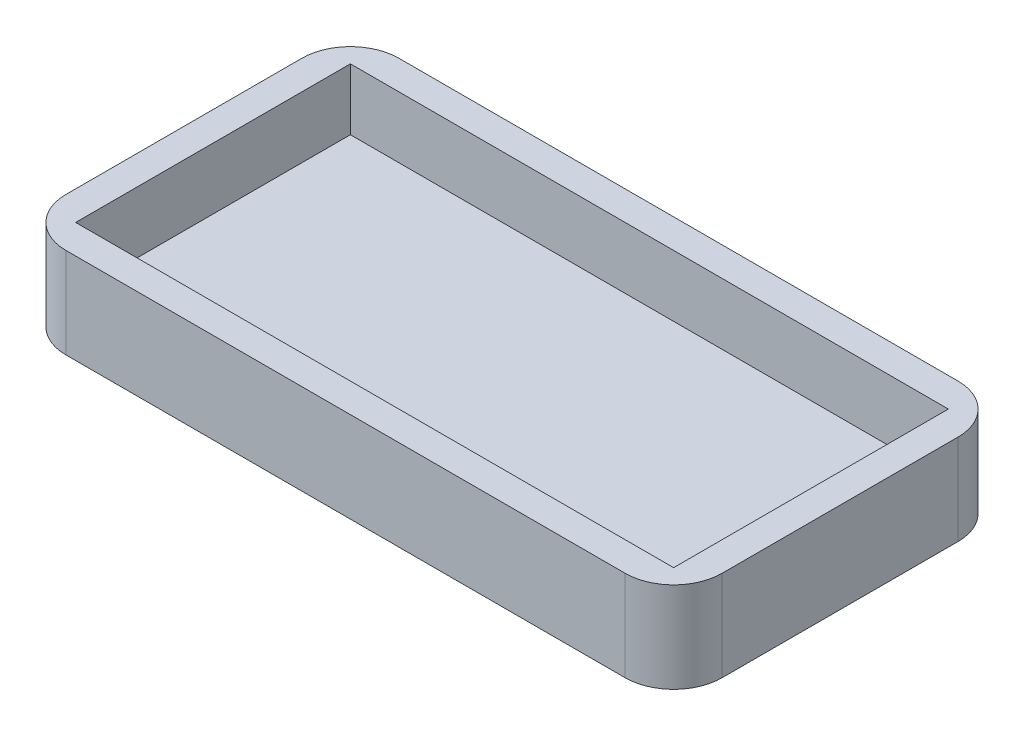
ISO-10303-21;
HEADER;
FILE_DESCRIPTION(('STEP AP214'),'2;1');
FILE_NAME('part.step','',(''),(''),'','','');
FILE_SCHEMA(('AUTOMOTIVE_DESIGN { 1 0 10303 214 1 1 1 1 }'));
ENDSEC;
DATA;
#1=APPLICATION_CONTEXT('core data for automotive mechanical design processes');
#2=APPLICATION_PROTOCOL_DEFINITION('international standard','automotive_design',2000,#1);
#3=PRODUCT_CONTEXT('',#1,'mechanical');
#4=PRODUCT('Part','Part','',(#3));
#5=PRODUCT_RELATED_PRODUCT_CATEGORY('part','',(#4));
#6=PRODUCT_DEFINITION_FORMATION('','',#4);
#7=PRODUCT_DEFINITION_CONTEXT('part definition',#1,'design');
#8=PRODUCT_DEFINITION('design','',#6,#7);
#9=PRODUCT_DEFINITION_SHAPE('','',#8);
#10=(LENGTH_UNIT() NAMED_UNIT(*) SI_UNIT(.MILLI.,.METRE.));
#11=(NAMED_UNIT(*) PLANE_ANGLE_UNIT() SI_UNIT($,.RADIAN.));
#12=(NAMED_UNIT(*) SI_UNIT($,.STERADIAN.) SOLID_ANGLE_UNIT());
#13=UNCERTAINTY_MEASURE_WITH_UNIT(LENGTH_MEASURE(1.E-05),#10,'distance_accuracy_value','');
#14=(GEOMETRIC_REPRESENTATION_CONTEXT(3) GLOBAL_UNCERTAINTY_ASSIGNED_CONTEXT((#13)) GLOBAL_UNIT_ASSIGNED_CONTEXT((#10,
#11,#12)) REPRESENTATION_CONTEXT('',''));
#15=CARTESIAN_POINT('',(0.,0.,0.));
#16=DIRECTION('',(0.,0.,1.));
#17=DIRECTION('',(1.,0.,0.));
#18=AXIS2_PLACEMENT_3D('',#15,#16,#17);
#19=CARTESIAN_POINT('',(0.,3.8,0.));
#20=DIRECTION('',(0.,-1.,0.));
#21=DIRECTION('',(0.,0.,-1.));
#22=AXIS2_PLACEMENT_3D('',#19,#20,#21);
#23=PLANE('',#22);
#24=DIRECTION('',(0.,0.,-1.));
#25=VECTOR('',#24,1.);
#26=CARTESIAN_POINT('',(20.3,3.8,0.));
#27=LINE('',#26,#25);
#28=CARTESIAN_POINT('',(20.3,3.8,7.3));
#29=VERTEX_POINT('',#28);
#30=CARTESIAN_POINT('',(20.3,3.8,-7.3));
#31=VERTEX_POINT('',#30);
#32=EDGE_CURVE('E175',#29,#31,#27,.T.);
#33=ORIENTED_EDGE('',*,*,#32,.T.);
#34=CARTESIAN_POINT('',(17.3,3.8,-7.3));
#35=DIRECTION('',(0.,-1.,0.));
#36=DIRECTION('',(0.,0.,-1.));
#37=AXIS2_PLACEMENT_3D('',#34,#35,#36);
#38=CIRCLE('',#37,3.);
#39=CARTESIAN_POINT('',(17.3,3.8,-10.3));
#40=VERTEX_POINT('',#39);
#41=EDGE_CURVE('E208',#31,#40,#38,.F.);
#42=ORIENTED_EDGE('',*,*,#41,.T.);
#43=DIRECTION('',(-1.,0.,0.));
#44=VECTOR('',#43,1.);
#45=CARTESIAN_POINT('',(0.,3.8,-10.3));
#46=LINE('',#45,#44);
#47=CARTESIAN_POINT('',(-17.3,3.8,-10.3));
#48=VERTEX_POINT('',#47);
#49=EDGE_CURVE('E178',#40,#48,#46,.T.);
#50=ORIENTED_EDGE('',*,*,#49,.T.);
#51=CARTESIAN_POINT('',(-17.3,3.8,-7.3));
#52=DIRECTION('',(0.,-1.,0.));
#53=DIRECTION('',(0.,0.,-1.));
#54=AXIS2_PLACEMENT_3D('',#51,#52,#53);
#55=CIRCLE('',#54,3.);
#56=CARTESIAN_POINT('',(-20.3,3.8,-7.3));
#57=VERTEX_POINT('',#56);
#58=EDGE_CURVE('E203',#48,#57,#55,.F.);
#59=ORIENTED_EDGE('',*,*,#58,.T.);
#60=DIRECTION('',(0.,0.,1.));
#61=VECTOR('',#60,1.);
#62=CARTESIAN_POINT('',(-20.3,3.8,0.));
#63=LINE('',#62,#61);
#64=CARTESIAN_POINT('',(-20.3,3.8,7.3));
#65=VERTEX_POINT('',#64);
#66=EDGE_CURVE('E181',#57,#65,#63,.T.);
#67=ORIENTED_EDGE('',*,*,#66,.T.);
#68=CARTESIAN_POINT('',(-17.3,3.8,7.3));
#69=DIRECTION('',(0.,-1.,0.));
#70=DIRECTION('',(0.,0.,-1.));
#71=AXIS2_PLACEMENT_3D('',#68,#69,#70);
#72=CIRCLE('',#71,3.);
#73=CARTESIAN_POINT('',(-17.3,3.8,10.3));
#74=VERTEX_POINT('',#73);
#75=EDGE_CURVE('E55',#65,#74,#72,.F.);
#76=ORIENTED_EDGE('',*,*,#75,.T.);
#77=DIRECTION('',(1.,0.,0.));
#78=VECTOR('',#77,1.);
#79=CARTESIAN_POINT('',(0.,3.8,10.3));
#80=LINE('',#79,#78);
#81=CARTESIAN_POINT('',(17.3,3.8,10.3));
#82=VERTEX_POINT('',#81);
#83=EDGE_CURVE('E183',#74,#82,#80,.T.);
#84=ORIENTED_EDGE('',*,*,#83,.T.);
#85=CARTESIAN_POINT('',(17.3,3.8,7.3));
#86=DIRECTION('',(0.,-1.,0.));
#87=DIRECTION('',(0.,0.,-1.));
#88=AXIS2_PLACEMENT_3D('',#85,#86,#87);
#89=CIRCLE('',#88,3.);
#90=EDGE_CURVE('E206',#82,#29,#89,.F.);
#91=ORIENTED_EDGE('',*,*,#90,.T.);
#92=EDGE_LOOP('',(#33,#42,#50,#59,#67,#76,#84,#91));
#93=FACE_BOUND('',#92,.T.);
#94=DIRECTION('',(0.,0.,-1.));
#95=VECTOR('',#94,1.);
#96=CARTESIAN_POINT('',(18.5,3.8,8.5));
#97=LINE('',#96,#95);
#98=CARTESIAN_POINT('',(18.5,3.8,8.5));
#99=VERTEX_POINT('',#98);
#100=CARTESIAN_POINT('',(18.5,3.8,-8.5));
#101=VERTEX_POINT('',#100);
#102=EDGE_CURVE('E124',#99,#101,#97,.T.);
#103=ORIENTED_EDGE('',*,*,#102,.F.);
#104=DIRECTION('',(1.,0.,0.));
#105=VECTOR('',#104,1.);
#106=CARTESIAN_POINT('',(-18.5,3.8,8.5));
#107=LINE('',#106,#105);
#108=CARTESIAN_POINT('',(-18.5,3.8,8.5));
#109=VERTEX_POINT('',#108);
#110=EDGE_CURVE('E150',#109,#99,#107,.T.);
#111=ORIENTED_EDGE('',*,*,#110,.F.);
#112=DIRECTION('',(0.,0.,1.));
#113=VECTOR('',#112,1.);
#114=CARTESIAN_POINT('',(-18.5,3.8,8.5));
#115=LINE('',#114,#113);
#116=CARTESIAN_POINT('',(-18.5,3.8,-8.5));
#117=VERTEX_POINT('',#116);
#118=EDGE_CURVE('E148',#117,#109,#115,.T.);
#119=ORIENTED_EDGE('',*,*,#118,.F.);
#120=DIRECTION('',(-1.,0.,0.));
#121=VECTOR('',#120,1.);
#122=CARTESIAN_POINT('',(-18.5,3.8,-8.5));
#123=LINE('',#122,#121);
#124=EDGE_CURVE('E135',#101,#117,#123,.T.);
#125=ORIENTED_EDGE('',*,*,#124,.F.);
#126=EDGE_LOOP('',(#103,#111,#119,#125));
#127=FACE_BOUND('',#126,.T.);
#128=ADVANCED_FACE('F33',(#93,#127),#23,.F.);
#129=CARTESIAN_POINT('',(20.3,3.8,8.5));
#130=DIRECTION('',(-1.,0.,0.));
#131=DIRECTION('',(0.,0.,1.));
#132=AXIS2_PLACEMENT_3D('',#129,#130,#131);
#133=PLANE('',#132);
#134=DIRECTION('',(0.,0.,-1.));
#135=VECTOR('',#134,1.);
#136=CARTESIAN_POINT('',(20.3,-1.8,0.));
#137=LINE('',#136,#135);
#138=CARTESIAN_POINT('',(20.3,-1.8,7.3));
#139=VERTEX_POINT('',#138);
#140=CARTESIAN_POINT('',(20.3,-1.8,-7.3));
#141=VERTEX_POINT('',#140);
#142=EDGE_CURVE('E143',#139,#141,#137,.T.);
#143=ORIENTED_EDGE('',*,*,#142,.T.);
#144=DIRECTION('',(0.,-1.,0.));
#145=VECTOR('',#144,1.);
#146=CARTESIAN_POINT('',(20.3,3.8,-7.3));
#147=LINE('',#146,#145);
#148=EDGE_CURVE('E201',#141,#31,#147,.F.);
#149=ORIENTED_EDGE('',*,*,#148,.T.);
#150=ORIENTED_EDGE('',*,*,#32,.F.);
#151=DIRECTION('',(0.,-1.,0.));
#152=VECTOR('',#151,1.);
#153=CARTESIAN_POINT('',(20.3,3.8,7.3));
#154=LINE('',#153,#152);
#155=EDGE_CURVE('E198',#29,#139,#154,.T.);
#156=ORIENTED_EDGE('',*,*,#155,.T.);
#157=EDGE_LOOP('',(#143,#149,#150,#156));
#158=FACE_BOUND('',#157,.T.);
#159=ADVANCED_FACE('F237',(#158),#133,.F.);
#160=CARTESIAN_POINT('',(-18.5,3.8,-10.3));
#161=DIRECTION('',(0.,0.,1.));
#162=DIRECTION('',(1.,0.,0.));
#163=AXIS2_PLACEMENT_3D('',#160,#161,#162);
#164=PLANE('',#163);
#165=ORIENTED_EDGE('',*,*,#49,.F.);
#166=DIRECTION('',(0.,-1.,0.));
#167=VECTOR('',#166,1.);
#168=CARTESIAN_POINT('',(17.3,3.8,-10.3));
#169=LINE('',#168,#167);
#170=CARTESIAN_POINT('',(17.3,-1.8,-10.3));
#171=VERTEX_POINT('',#170);
#172=EDGE_CURVE('E187',#40,#171,#169,.T.);
#173=ORIENTED_EDGE('',*,*,#172,.T.);
#174=DIRECTION('',(-1.,0.,0.));
#175=VECTOR('',#174,1.);
#176=CARTESIAN_POINT('',(0.,-1.8,-10.3));
#177=LINE('',#176,#175);
#178=CARTESIAN_POINT('',(-17.3,-1.8,-10.3));
#179=VERTEX_POINT('',#178);
#180=EDGE_CURVE('E167',#171,#179,#177,.T.);
#181=ORIENTED_EDGE('',*,*,#180,.T.);
#182=DIRECTION('',(0.,-1.,0.));
#183=VECTOR('',#182,1.);
#184=CARTESIAN_POINT('',(-17.3,3.8,-10.3));
#185=LINE('',#184,#183);
#186=EDGE_CURVE('E185',#179,#48,#185,.F.);
#187=ORIENTED_EDGE('',*,*,#186,.T.);
#188=EDGE_LOOP('',(#165,#173,#181,#187));
#189=FACE_BOUND('',#188,.T.);
#190=ADVANCED_FACE('F245',(#189),#164,.F.);
#191=CARTESIAN_POINT('',(-20.3,3.8,8.5));
#192=DIRECTION('',(1.,0.,0.));
#193=DIRECTION('',(0.,0.,-1.));
#194=AXIS2_PLACEMENT_3D('',#191,#192,#193);
#195=PLANE('',#194);
#196=DIRECTION('',(0.,0.,1.));
#197=VECTOR('',#196,1.);
#198=CARTESIAN_POINT('',(-20.3,-1.8,0.));
#199=LINE('',#198,#197);
#200=CARTESIAN_POINT('',(-20.3,-1.8,-7.3));
#201=VERTEX_POINT('',#200);
#202=CARTESIAN_POINT('',(-20.3,-1.8,7.3));
#203=VERTEX_POINT('',#202);
#204=EDGE_CURVE('E170',#201,#203,#199,.T.);
#205=ORIENTED_EDGE('',*,*,#204,.T.);
#206=DIRECTION('',(0.,-1.,0.));
#207=VECTOR('',#206,1.);
#208=CARTESIAN_POINT('',(-20.3,3.8,7.3));
#209=LINE('',#208,#207);
#210=EDGE_CURVE('E11',#203,#65,#209,.F.);
#211=ORIENTED_EDGE('',*,*,#210,.T.);
#212=ORIENTED_EDGE('',*,*,#66,.F.);
#213=DIRECTION('',(0.,-1.,0.));
#214=VECTOR('',#213,1.);
#215=CARTESIAN_POINT('',(-20.3,3.8,-7.3));
#216=LINE('',#215,#214);
#217=EDGE_CURVE('E41',#57,#201,#216,.T.);
#218=ORIENTED_EDGE('',*,*,#217,.T.);
#219=EDGE_LOOP('',(#205,#211,#212,#218));
#220=FACE_BOUND('',#219,.T.);
#221=ADVANCED_FACE('F218',(#220),#195,.F.);
#222=CARTESIAN_POINT('',(-18.5,3.8,10.3));
#223=DIRECTION('',(0.,0.,-1.));
#224=DIRECTION('',(-1.,0.,0.));
#225=AXIS2_PLACEMENT_3D('',#222,#223,#224);
#226=PLANE('',#225);
#227=DIRECTION('',(1.,0.,0.));
#228=VECTOR('',#227,1.);
#229=CARTESIAN_POINT('',(0.,-1.8,10.3));
#230=LINE('',#229,#228);
#231=CARTESIAN_POINT('',(-17.3,-1.8,10.3));
#232=VERTEX_POINT('',#231);
#233=CARTESIAN_POINT('',(17.3,-1.8,10.3));
#234=VERTEX_POINT('',#233);
#235=EDGE_CURVE('E173',#232,#234,#230,.T.);
#236=ORIENTED_EDGE('',*,*,#235,.T.);
#237=DIRECTION('',(0.,-1.,0.));
#238=VECTOR('',#237,1.);
#239=CARTESIAN_POINT('',(17.3,3.8,10.3));
#240=LINE('',#239,#238);
#241=EDGE_CURVE('E48',#234,#82,#240,.F.);
#242=ORIENTED_EDGE('',*,*,#241,.T.);
#243=ORIENTED_EDGE('',*,*,#83,.F.);
#244=DIRECTION('',(0.,-1.,0.));
#245=VECTOR('',#244,1.);
#246=CARTESIAN_POINT('',(-17.3,3.8,10.3));
#247=LINE('',#246,#245);
#248=EDGE_CURVE('E210',#74,#232,#247,.T.);
#249=ORIENTED_EDGE('',*,*,#248,.T.);
#250=EDGE_LOOP('',(#236,#242,#243,#249));
#251=FACE_BOUND('',#250,.T.);
#252=ADVANCED_FACE('F229',(#251),#226,.F.);
#253=CARTESIAN_POINT('',(0.,-1.8,0.));
#254=DIRECTION('',(0.,-1.,0.));
#255=DIRECTION('',(0.,0.,-1.));
#256=AXIS2_PLACEMENT_3D('',#253,#254,#255);
#257=PLANE('',#256);
#258=ORIENTED_EDGE('',*,*,#180,.F.);
#259=CARTESIAN_POINT('',(17.3,-1.8,-7.3));
#260=DIRECTION('',(0.,-1.,0.));
#261=DIRECTION('',(0.,0.,-1.));
#262=AXIS2_PLACEMENT_3D('',#259,#260,#261);
#263=CIRCLE('',#262,3.);
#264=EDGE_CURVE('E196',#171,#141,#263,.T.);
#265=ORIENTED_EDGE('',*,*,#264,.T.);
#266=ORIENTED_EDGE('',*,*,#142,.F.);
#267=CARTESIAN_POINT('',(17.3,-1.8,7.3));
#268=DIRECTION('',(0.,-1.,0.));
#269=DIRECTION('',(0.,0.,-1.));
#270=AXIS2_PLACEMENT_3D('',#267,#268,#269);
#271=CIRCLE('',#270,3.);
#272=EDGE_CURVE('E194',#139,#234,#271,.T.);
#273=ORIENTED_EDGE('',*,*,#272,.T.);
#274=ORIENTED_EDGE('',*,*,#235,.F.);
#275=CARTESIAN_POINT('',(-17.3,-1.8,7.3));
#276=DIRECTION('',(0.,-1.,0.));
#277=DIRECTION('',(0.,0.,-1.));
#278=AXIS2_PLACEMENT_3D('',#275,#276,#277);
#279=CIRCLE('',#278,3.);
#280=EDGE_CURVE('E192',#232,#203,#279,.T.);
#281=ORIENTED_EDGE('',*,*,#280,.T.);
#282=ORIENTED_EDGE('',*,*,#204,.F.);
#283=CARTESIAN_POINT('',(-17.3,-1.8,-7.3));
#284=DIRECTION('',(0.,-1.,0.));
#285=DIRECTION('',(0.,0.,-1.));
#286=AXIS2_PLACEMENT_3D('',#283,#284,#285);
#287=CIRCLE('',#286,3.);
#288=EDGE_CURVE('E190',#201,#179,#287,.T.);
#289=ORIENTED_EDGE('',*,*,#288,.T.);
#290=EDGE_LOOP('',(#258,#265,#266,#273,#274,#281,#282,#289));
#291=FACE_BOUND('',#290,.T.);
#292=ADVANCED_FACE('F224',(#291),#257,.T.);
#293=CARTESIAN_POINT('',(18.5,3.8,8.5));
#294=DIRECTION('',(-1.,0.,0.));
#295=DIRECTION('',(0.,0.,1.));
#296=AXIS2_PLACEMENT_3D('',#293,#294,#295);
#297=PLANE('',#296);
#298=DIRECTION('',(0.,0.,-1.));
#299=VECTOR('',#298,1.);
#300=CARTESIAN_POINT('',(18.5,0.,8.5));
#301=LINE('',#300,#299);
#302=CARTESIAN_POINT('',(18.5,0.,8.5));
#303=VERTEX_POINT('',#302);
#304=CARTESIAN_POINT('',(18.5,0.,-8.5));
#305=VERTEX_POINT('',#304);
#306=EDGE_CURVE('E154',#303,#305,#301,.T.);
#307=ORIENTED_EDGE('',*,*,#306,.F.);
#308=DIRECTION('',(0.,-1.,0.));
#309=VECTOR('',#308,1.);
#310=CARTESIAN_POINT('',(18.5,3.8,8.5));
#311=LINE('',#310,#309);
#312=EDGE_CURVE('E131',#99,#303,#311,.T.);
#313=ORIENTED_EDGE('',*,*,#312,.F.);
#314=ORIENTED_EDGE('',*,*,#102,.T.);
#315=DIRECTION('',(0.,-1.,0.));
#316=VECTOR('',#315,1.);
#317=CARTESIAN_POINT('',(18.5,3.8,-8.5));
#318=LINE('',#317,#316);
#319=EDGE_CURVE('E128',#101,#305,#318,.T.);
#320=ORIENTED_EDGE('',*,*,#319,.T.);
#321=EDGE_LOOP('',(#307,#313,#314,#320));
#322=FACE_BOUND('',#321,.T.);
#323=ADVANCED_FACE('F127',(#322),#297,.T.);
#324=CARTESIAN_POINT('',(-18.5,3.8,-8.5));
#325=DIRECTION('',(0.,0.,1.));
#326=DIRECTION('',(1.,0.,0.));
#327=AXIS2_PLACEMENT_3D('',#324,#325,#326);
#328=PLANE('',#327);
#329=DIRECTION('',(-1.,0.,0.));
#330=VECTOR('',#329,1.);
#331=CARTESIAN_POINT('',(-18.5,0.,-8.5));
#332=LINE('',#331,#330);
#333=CARTESIAN_POINT('',(-18.5,0.,-8.5));
#334=VERTEX_POINT('',#333);
#335=EDGE_CURVE('E142',#305,#334,#332,.T.);
#336=ORIENTED_EDGE('',*,*,#335,.F.);
#337=ORIENTED_EDGE('',*,*,#319,.F.);
#338=ORIENTED_EDGE('',*,*,#124,.T.);
#339=DIRECTION('',(0.,-1.,0.));
#340=VECTOR('',#339,1.);
#341=CARTESIAN_POINT('',(-18.5,3.8,-8.5));
#342=LINE('',#341,#340);
#343=EDGE_CURVE('E144',#117,#334,#342,.T.);
#344=ORIENTED_EDGE('',*,*,#343,.T.);
#345=EDGE_LOOP('',(#336,#337,#338,#344));
#346=FACE_BOUND('',#345,.T.);
#347=ADVANCED_FACE('F139',(#346),#328,.T.);
#348=CARTESIAN_POINT('',(-18.5,3.8,8.5));
#349=DIRECTION('',(1.,0.,0.));
#350=DIRECTION('',(0.,0.,-1.));
#351=AXIS2_PLACEMENT_3D('',#348,#349,#350);
#352=PLANE('',#351);
#353=DIRECTION('',(0.,0.,1.));
#354=VECTOR('',#353,1.);
#355=CARTESIAN_POINT('',(-18.5,0.,8.5));
#356=LINE('',#355,#354);
#357=CARTESIAN_POINT('',(-18.5,0.,8.5));
#358=VERTEX_POINT('',#357);
#359=EDGE_CURVE('E157',#334,#358,#356,.T.);
#360=ORIENTED_EDGE('',*,*,#359,.F.);
#361=ORIENTED_EDGE('',*,*,#343,.F.);
#362=ORIENTED_EDGE('',*,*,#118,.T.);
#363=DIRECTION('',(0.,-1.,0.));
#364=VECTOR('',#363,1.);
#365=CARTESIAN_POINT('',(-18.5,3.8,8.5));
#366=LINE('',#365,#364);
#367=EDGE_CURVE('E161',#109,#358,#366,.T.);
#368=ORIENTED_EDGE('',*,*,#367,.T.);
#369=EDGE_LOOP('',(#360,#361,#362,#368));
#370=FACE_BOUND('',#369,.T.);
#371=ADVANCED_FACE('F334',(#370),#352,.T.);
#372=CARTESIAN_POINT('',(-18.5,3.8,8.5));
#373=DIRECTION('',(0.,0.,-1.));
#374=DIRECTION('',(-1.,0.,0.));
#375=AXIS2_PLACEMENT_3D('',#372,#373,#374);
#376=PLANE('',#375);
#377=DIRECTION('',(1.,0.,0.));
#378=VECTOR('',#377,1.);
#379=CARTESIAN_POINT('',(-18.5,0.,8.5));
#380=LINE('',#379,#378);
#381=EDGE_CURVE('E136',#358,#303,#380,.T.);
#382=ORIENTED_EDGE('',*,*,#381,.F.);
#383=ORIENTED_EDGE('',*,*,#367,.F.);
#384=ORIENTED_EDGE('',*,*,#110,.T.);
#385=ORIENTED_EDGE('',*,*,#312,.T.);
#386=EDGE_LOOP('',(#382,#383,#384,#385));
#387=FACE_BOUND('',#386,.T.);
#388=ADVANCED_FACE('F325',(#387),#376,.T.);
#389=CARTESIAN_POINT('',(0.,0.,0.));
#390=DIRECTION('',(0.,-1.,0.));
#391=DIRECTION('',(0.,0.,-1.));
#392=AXIS2_PLACEMENT_3D('',#389,#390,#391);
#393=PLANE('',#392);
#394=ORIENTED_EDGE('',*,*,#306,.T.);
#395=ORIENTED_EDGE('',*,*,#335,.T.);
#396=ORIENTED_EDGE('',*,*,#359,.T.);
#397=ORIENTED_EDGE('',*,*,#381,.T.);
#398=EDGE_LOOP('',(#394,#395,#396,#397));
#399=FACE_BOUND('',#398,.T.);
#400=ADVANCED_FACE('F270',(#399),#393,.F.);
#401=CARTESIAN_POINT('',(17.3,3.8,-7.3));
#402=DIRECTION('',(0.,-1.,0.));
#403=DIRECTION('',(0.,0.,-1.));
#404=AXIS2_PLACEMENT_3D('',#401,#402,#403);
#405=CYLINDRICAL_SURFACE('',#404,3.);
#406=ORIENTED_EDGE('',*,*,#41,.F.);
#407=ORIENTED_EDGE('',*,*,#148,.F.);
#408=ORIENTED_EDGE('',*,*,#264,.F.);
#409=ORIENTED_EDGE('',*,*,#172,.F.);
#410=EDGE_LOOP('',(#406,#407,#408,#409));
#411=FACE_BOUND('',#410,.T.);
#412=ADVANCED_FACE('F242',(#411),#405,.T.);
#413=CARTESIAN_POINT('',(17.3,3.8,7.3));
#414=DIRECTION('',(0.,-1.,0.));
#415=DIRECTION('',(0.,0.,-1.));
#416=AXIS2_PLACEMENT_3D('',#413,#414,#415);
#417=CYLINDRICAL_SURFACE('',#416,3.);
#418=ORIENTED_EDGE('',*,*,#90,.F.);
#419=ORIENTED_EDGE('',*,*,#241,.F.);
#420=ORIENTED_EDGE('',*,*,#272,.F.);
#421=ORIENTED_EDGE('',*,*,#155,.F.);
#422=EDGE_LOOP('',(#418,#419,#420,#421));
#423=FACE_BOUND('',#422,.T.);
#424=ADVANCED_FACE('F234',(#423),#417,.T.);
#425=CARTESIAN_POINT('',(-17.3,3.8,7.3));
#426=DIRECTION('',(0.,-1.,0.));
#427=DIRECTION('',(0.,0.,-1.));
#428=AXIS2_PLACEMENT_3D('',#425,#426,#427);
#429=CYLINDRICAL_SURFACE('',#428,3.);
#430=ORIENTED_EDGE('',*,*,#75,.F.);
#431=ORIENTED_EDGE('',*,*,#210,.F.);
#432=ORIENTED_EDGE('',*,*,#280,.F.);
#433=ORIENTED_EDGE('',*,*,#248,.F.);
#434=EDGE_LOOP('',(#430,#431,#432,#433));
#435=FACE_BOUND('',#434,.T.);
#436=ADVANCED_FACE('F228',(#435),#429,.T.);
#437=CARTESIAN_POINT('',(-17.3,3.8,-7.3));
#438=DIRECTION('',(0.,-1.,0.));
#439=DIRECTION('',(0.,0.,-1.));
#440=AXIS2_PLACEMENT_3D('',#437,#438,#439);
#441=CYLINDRICAL_SURFACE('',#440,3.);
#442=ORIENTED_EDGE('',*,*,#58,.F.);
#443=ORIENTED_EDGE('',*,*,#186,.F.);
#444=ORIENTED_EDGE('',*,*,#288,.F.);
#445=ORIENTED_EDGE('',*,*,#217,.F.);
#446=EDGE_LOOP('',(#442,#443,#444,#445));
#447=FACE_BOUND('',#446,.T.);
#448=ADVANCED_FACE('F35',(#447),#441,.T.);
#449=CLOSED_SHELL('',(#128,#159,#190,#221,#252,#292,#323,#347,#371,#388,#400,#412,#424,#436,#448));
#450=MANIFOLD_SOLID_BREP('B2',#449);
#451=ADVANCED_BREP_SHAPE_REPRESENTATION('',(#18,#450),#14);
#452=SHAPE_DEFINITION_REPRESENTATION(#9,#451);
ENDSEC;
END-ISO-10303-21;
